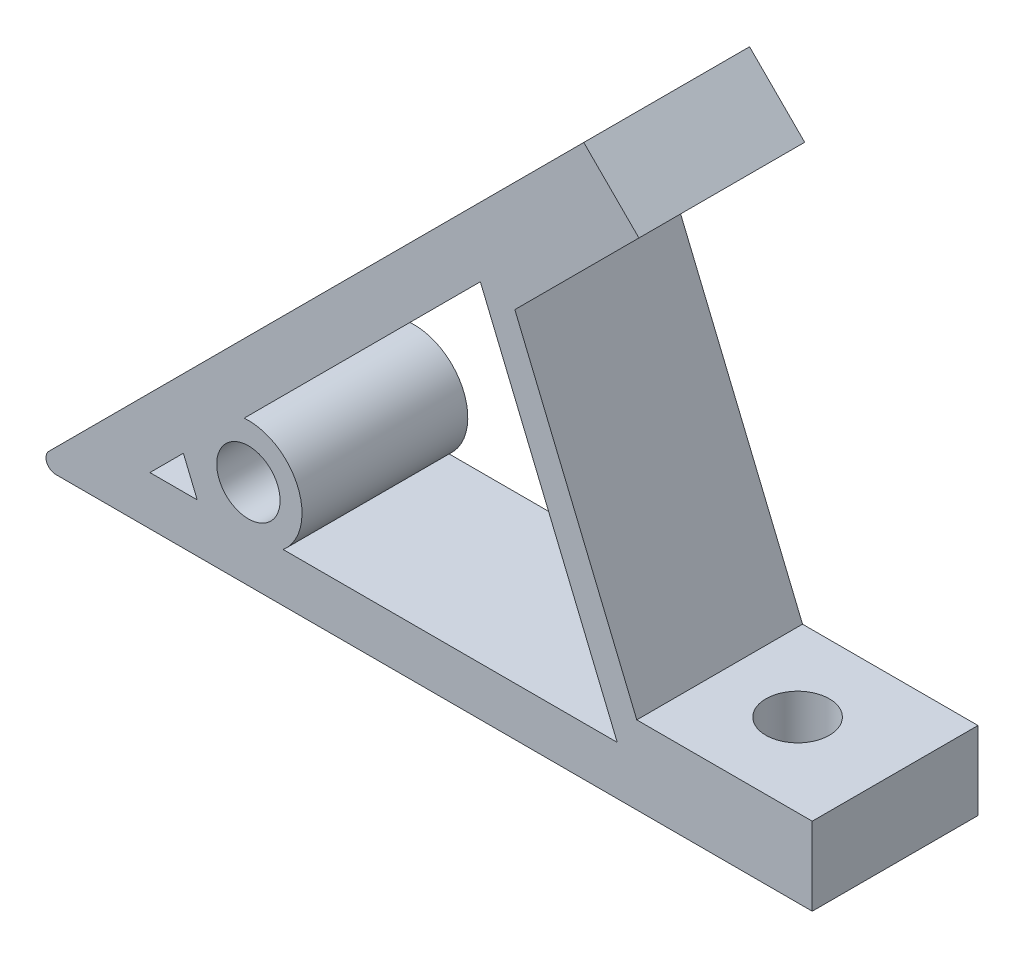
ISO-10303-21;
HEADER;
FILE_DESCRIPTION(('STEP AP214'),'2;1');
FILE_NAME('part.step','',(''),(''),'','','');
FILE_SCHEMA(('AUTOMOTIVE_DESIGN { 1 0 10303 214 1 1 1 1 }'));
ENDSEC;
DATA;
#1=APPLICATION_CONTEXT('core data for automotive mechanical design processes');
#2=APPLICATION_PROTOCOL_DEFINITION('international standard','automotive_design',2000,#1);
#3=PRODUCT_CONTEXT('',#1,'mechanical');
#4=PRODUCT('Part','Part','',(#3));
#5=PRODUCT_RELATED_PRODUCT_CATEGORY('part','',(#4));
#6=PRODUCT_DEFINITION_FORMATION('','',#4);
#7=PRODUCT_DEFINITION_CONTEXT('part definition',#1,'design');
#8=PRODUCT_DEFINITION('design','',#6,#7);
#9=PRODUCT_DEFINITION_SHAPE('','',#8);
#10=(LENGTH_UNIT() NAMED_UNIT(*) SI_UNIT(.MILLI.,.METRE.));
#11=(NAMED_UNIT(*) PLANE_ANGLE_UNIT() SI_UNIT($,.RADIAN.));
#12=(NAMED_UNIT(*) SI_UNIT($,.STERADIAN.) SOLID_ANGLE_UNIT());
#13=UNCERTAINTY_MEASURE_WITH_UNIT(LENGTH_MEASURE(1.E-05),#10,'distance_accuracy_value','');
#14=(GEOMETRIC_REPRESENTATION_CONTEXT(3) GLOBAL_UNCERTAINTY_ASSIGNED_CONTEXT((#13)) GLOBAL_UNIT_ASSIGNED_CONTEXT((#10,
#11,#12)) REPRESENTATION_CONTEXT('',''));
#15=CARTESIAN_POINT('',(0.,0.,0.));
#16=DIRECTION('',(0.,0.,1.));
#17=DIRECTION('',(1.,0.,0.));
#18=AXIS2_PLACEMENT_3D('',#15,#16,#17);
#19=CARTESIAN_POINT('',(-30.4993179415646,38.1869735594505,8.5));
#20=DIRECTION('',(-0.707106781186548,0.707106781186547,0.));
#21=DIRECTION('',(-0.707106781186547,-0.707106781186548,0.));
#22=AXIS2_PLACEMENT_3D('',#19,#20,#21);
#23=PLANE('',#22);
#24=DIRECTION('',(0.707106781186547,0.707106781186548,0.));
#25=VECTOR('',#24,1.);
#26=CARTESIAN_POINT('',(-30.4993179415646,38.1869735594505,-8.5));
#27=LINE('',#26,#25);
#28=CARTESIAN_POINT('',(-30.4993179415646,38.1869735594505,-8.5));
#29=VERTEX_POINT('',#28);
#30=CARTESIAN_POINT('',(-17.7746032555838,50.9116882454314,-8.5));
#31=VERTEX_POINT('',#30);
#32=EDGE_CURVE('E236',#29,#31,#27,.T.);
#33=ORIENTED_EDGE('',*,*,#32,.T.);
#34=DIRECTION('',(0.,0.,-1.));
#35=VECTOR('',#34,1.);
#36=CARTESIAN_POINT('',(-17.7746032555838,50.9116882454314,8.5));
#37=LINE('',#36,#35);
#38=CARTESIAN_POINT('',(-17.7746032555838,50.9116882454314,8.5));
#39=VERTEX_POINT('',#38);
#40=EDGE_CURVE('E246',#39,#31,#37,.T.);
#41=ORIENTED_EDGE('',*,*,#40,.F.);
#42=DIRECTION('',(0.707106781186547,0.707106781186548,0.));
#43=VECTOR('',#42,1.);
#44=CARTESIAN_POINT('',(-30.4993179415646,38.1869735594505,8.5));
#45=LINE('',#44,#43);
#46=CARTESIAN_POINT('',(-30.4993179415646,38.1869735594505,8.5));
#47=VERTEX_POINT('',#46);
#48=EDGE_CURVE('E219',#47,#39,#45,.T.);
#49=ORIENTED_EDGE('',*,*,#48,.F.);
#50=DIRECTION('',(0.,0.,-1.));
#51=VECTOR('',#50,1.);
#52=CARTESIAN_POINT('',(-30.4993179415646,38.1869735594505,8.5));
#53=LINE('',#52,#51);
#54=EDGE_CURVE('E249',#47,#29,#53,.T.);
#55=ORIENTED_EDGE('',*,*,#54,.T.);
#56=EDGE_LOOP('',(#33,#41,#49,#55));
#57=FACE_BOUND('',#56,.T.);
#58=CARTESIAN_POINT('',(-24.8456710674492,43.8406204335659,0.));
#59=DIRECTION('',(-0.70710678118655,0.707106781186545,0.));
#60=DIRECTION('',(-0.707106781186546,-0.707106781186549,0.));
#61=AXIS2_PLACEMENT_3D('',#58,#59,#60);
#62=CIRCLE('',#61,3.25);
#63=CARTESIAN_POINT('',(-27.1437681063054,41.5425233947096,0.));
#64=VERTEX_POINT('',#63);
#65=EDGE_CURVE('E305',#64,#64,#62,.T.);
#66=ORIENTED_EDGE('',*,*,#65,.T.);
#67=EDGE_LOOP('',(#66));
#68=FACE_BOUND('',#67,.T.);
#69=ADVANCED_FACE('F35',(#57,#68),#23,.F.);
#70=CARTESIAN_POINT('',(-78.2928932188134,1.7071067811866,8.5));
#71=DIRECTION('',(0.707106781186548,-0.707106781186547,0.));
#72=DIRECTION('',(0.707106781186547,0.707106781186548,0.));
#73=AXIS2_PLACEMENT_3D('',#70,#71,#72);
#74=PLANE('',#73);
#75=DIRECTION('',(-0.707106781186547,-0.707106781186548,0.));
#76=VECTOR('',#75,1.);
#77=CARTESIAN_POINT('',(-78.2928932188134,1.7071067811866,-8.5));
#78=LINE('',#77,#76);
#79=CARTESIAN_POINT('',(-23.4314575050762,56.5685424949238,-8.5));
#80=VERTEX_POINT('',#79);
#81=CARTESIAN_POINT('',(-78.2928932188134,1.7071067811866,-8.5));
#82=VERTEX_POINT('',#81);
#83=EDGE_CURVE('E211',#80,#82,#78,.T.);
#84=ORIENTED_EDGE('',*,*,#83,.T.);
#85=DIRECTION('',(0.,0.,-1.));
#86=VECTOR('',#85,1.);
#87=CARTESIAN_POINT('',(-78.2928932188134,1.7071067811866,8.5));
#88=LINE('',#87,#86);
#89=CARTESIAN_POINT('',(-78.2928932188134,1.7071067811866,8.5));
#90=VERTEX_POINT('',#89);
#91=EDGE_CURVE('E225',#90,#82,#88,.T.);
#92=ORIENTED_EDGE('',*,*,#91,.F.);
#93=DIRECTION('',(-0.707106781186547,-0.707106781186548,0.));
#94=VECTOR('',#93,1.);
#95=CARTESIAN_POINT('',(-78.2928932188134,1.7071067811866,8.5));
#96=LINE('',#95,#94);
#97=CARTESIAN_POINT('',(-23.4314575050762,56.5685424949238,8.5));
#98=VERTEX_POINT('',#97);
#99=EDGE_CURVE('E223',#98,#90,#96,.T.);
#100=ORIENTED_EDGE('',*,*,#99,.F.);
#101=DIRECTION('',(0.,0.,-1.));
#102=VECTOR('',#101,1.);
#103=CARTESIAN_POINT('',(-23.4314575050762,56.5685424949238,8.5));
#104=LINE('',#103,#102);
#105=EDGE_CURVE('E243',#98,#80,#104,.T.);
#106=ORIENTED_EDGE('',*,*,#105,.T.);
#107=EDGE_LOOP('',(#84,#92,#100,#106));
#108=FACE_BOUND('',#107,.T.);
#109=CARTESIAN_POINT('',(-30.5025253169417,49.4974746830583,0.));
#110=DIRECTION('',(0.707106781186548,-0.707106781186547,0.));
#111=DIRECTION('',(0.707106781186547,0.707106781186548,0.));
#112=AXIS2_PLACEMENT_3D('',#109,#110,#111);
#113=CIRCLE('',#112,3.25);
#114=CARTESIAN_POINT('',(-28.2044282780854,51.7955717219146,0.));
#115=VERTEX_POINT('',#114);
#116=EDGE_CURVE('E39',#115,#115,#113,.F.);
#117=ORIENTED_EDGE('',*,*,#116,.F.);
#118=EDGE_LOOP('',(#117));
#119=FACE_BOUND('',#118,.T.);
#120=ADVANCED_FACE('F292',(#108,#119),#74,.F.);
#121=CARTESIAN_POINT('',(-77.5857864376269,1.,8.5));
#122=DIRECTION('',(0.,0.,1.));
#123=DIRECTION('',(1.,0.,0.));
#124=AXIS2_PLACEMENT_3D('',#121,#122,#123);
#125=PLANE('',#124);
#126=DIRECTION('',(1.,0.,0.));
#127=VECTOR('',#126,1.);
#128=CARTESIAN_POINT('',(-54.2574687525298,5.,8.5));
#129=LINE('',#128,#127);
#130=CARTESIAN_POINT('',(-54.2574687525298,5.,8.5));
#131=VERTEX_POINT('',#130);
#132=CARTESIAN_POINT('',(-20.,5.,8.5));
#133=VERTEX_POINT('',#132);
#134=EDGE_CURVE('E151',#131,#133,#129,.T.);
#135=ORIENTED_EDGE('',*,*,#134,.F.);
#136=CARTESIAN_POINT('',(-57.8268912197291,9.18440237676214,8.5));
#137=DIRECTION('',(0.,0.,-1.));
#138=DIRECTION('',(1.,0.,0.));
#139=AXIS2_PLACEMENT_3D('',#136,#137,#138);
#140=CIRCLE('',#139,5.49999999999996);
#141=CARTESIAN_POINT('',(-58.2617476840749,14.6671845040599,8.5));
#142=VERTEX_POINT('',#141);
#143=EDGE_CURVE('E143',#142,#131,#140,.T.);
#144=ORIENTED_EDGE('',*,*,#143,.F.);
#145=DIRECTION('',(-0.707106781186549,-0.707106781186546,0.));
#146=VECTOR('',#145,1.);
#147=CARTESIAN_POINT('',(-58.2617476840749,14.6671845040599,8.5));
#148=LINE('',#147,#146);
#149=CARTESIAN_POINT('',(-34.0380592228744,38.8908729652603,8.5));
#150=VERTEX_POINT('',#149);
#151=EDGE_CURVE('E167',#150,#142,#148,.T.);
#152=ORIENTED_EDGE('',*,*,#151,.F.);
#153=DIRECTION('',(-0.382683432365087,0.923879532511288,0.));
#154=VECTOR('',#153,1.);
#155=CARTESIAN_POINT('',(-20.,5.,8.5));
#156=LINE('',#155,#154);
#157=EDGE_CURVE('E165',#133,#150,#156,.T.);
#158=ORIENTED_EDGE('',*,*,#157,.F.);
#159=EDGE_LOOP('',(#135,#144,#152,#158));
#160=FACE_BOUND('',#159,.T.);
#161=CARTESIAN_POINT('',(-77.5857864376269,1.,8.5));
#162=DIRECTION('',(0.,0.,1.));
#163=DIRECTION('',(1.,0.,0.));
#164=AXIS2_PLACEMENT_3D('',#161,#162,#163);
#165=CIRCLE('',#164,1.);
#166=CARTESIAN_POINT('',(-77.5857864376269,0.,8.5));
#167=VERTEX_POINT('',#166);
#168=EDGE_CURVE('E207',#90,#167,#165,.T.);
#169=ORIENTED_EDGE('',*,*,#168,.T.);
#170=DIRECTION('',(1.,0.,0.));
#171=VECTOR('',#170,1.);
#172=CARTESIAN_POINT('',(-77.5857864376269,0.,8.5));
#173=LINE('',#172,#171);
#174=CARTESIAN_POINT('',(0.,0.,8.5));
#175=VERTEX_POINT('',#174);
#176=EDGE_CURVE('E210',#167,#175,#173,.T.);
#177=ORIENTED_EDGE('',*,*,#176,.T.);
#178=DIRECTION('',(0.,1.,0.));
#179=VECTOR('',#178,1.);
#180=CARTESIAN_POINT('',(0.,0.,8.5));
#181=LINE('',#180,#179);
#182=CARTESIAN_POINT('',(0.,8.,8.5));
#183=VERTEX_POINT('',#182);
#184=EDGE_CURVE('E213',#175,#183,#181,.T.);
#185=ORIENTED_EDGE('',*,*,#184,.T.);
#186=DIRECTION('',(-1.,0.,0.));
#187=VECTOR('',#186,1.);
#188=CARTESIAN_POINT('',(-17.995464086242,8.00000000000012,8.5));
#189=LINE('',#188,#187);
#190=CARTESIAN_POINT('',(-17.995464086242,8.00000000000012,8.5));
#191=VERTEX_POINT('',#190);
#192=EDGE_CURVE('E215',#183,#191,#189,.T.);
#193=ORIENTED_EDGE('',*,*,#192,.T.);
#194=DIRECTION('',(-0.382683432365096,0.923879532511284,0.));
#195=VECTOR('',#194,1.);
#196=CARTESIAN_POINT('',(-17.995464086242,8.00000000000012,8.5));
#197=LINE('',#196,#195);
#198=EDGE_CURVE('E217',#191,#47,#197,.T.);
#199=ORIENTED_EDGE('',*,*,#198,.T.);
#200=ORIENTED_EDGE('',*,*,#48,.T.);
#201=DIRECTION('',(-0.707106781186548,0.707106781186547,0.));
#202=VECTOR('',#201,1.);
#203=CARTESIAN_POINT('',(-17.7746032555838,50.9116882454314,8.5));
#204=LINE('',#203,#202);
#205=EDGE_CURVE('E221',#39,#98,#204,.T.);
#206=ORIENTED_EDGE('',*,*,#205,.T.);
#207=ORIENTED_EDGE('',*,*,#99,.T.);
#208=EDGE_LOOP('',(#169,#177,#185,#193,#199,#200,#206,#207));
#209=FACE_BOUND('',#208,.T.);
#210=DIRECTION('',(1.,0.,0.));
#211=VECTOR('',#210,1.);
#212=CARTESIAN_POINT('',(-67.9289321881347,5.,8.5));
#213=LINE('',#212,#211);
#214=CARTESIAN_POINT('',(-67.9289321881347,5.,8.5));
#215=VERTEX_POINT('',#214);
#216=CARTESIAN_POINT('',(-63.0744704704145,5.00000000000011,8.5));
#217=VERTEX_POINT('',#216);
#218=EDGE_CURVE('E185',#215,#217,#213,.T.);
#219=ORIENTED_EDGE('',*,*,#218,.F.);
#220=DIRECTION('',(-0.70710678118656,-0.707106781186535,0.));
#221=VECTOR('',#220,1.);
#222=CARTESIAN_POINT('',(-67.9289321881347,5.,8.5));
#223=LINE('',#222,#221);
#224=CARTESIAN_POINT('',(-64.4963093885244,8.43262279961016,8.5));
#225=VERTEX_POINT('',#224);
#226=EDGE_CURVE('E183',#225,#215,#223,.T.);
#227=ORIENTED_EDGE('',*,*,#226,.F.);
#228=DIRECTION('',(-0.382683432365157,0.923879532511259,0.));
#229=VECTOR('',#228,1.);
#230=CARTESIAN_POINT('',(-63.0744704704145,5.00000000000011,8.5));
#231=LINE('',#230,#229);
#232=EDGE_CURVE('E189',#217,#225,#231,.T.);
#233=ORIENTED_EDGE('',*,*,#232,.F.);
#234=EDGE_LOOP('',(#219,#227,#233));
#235=FACE_BOUND('',#234,.T.);
#236=CARTESIAN_POINT('',(-57.8268912197291,9.18440237676214,8.5));
#237=DIRECTION('',(0.,0.,1.));
#238=DIRECTION('',(1.,0.,0.));
#239=AXIS2_PLACEMENT_3D('',#236,#237,#238);
#240=CIRCLE('',#239,3.25);
#241=CARTESIAN_POINT('',(-54.5768912197291,9.18440237676214,8.5));
#242=VERTEX_POINT('',#241);
#243=EDGE_CURVE('E173',#242,#242,#240,.T.);
#244=ORIENTED_EDGE('',*,*,#243,.F.);
#245=EDGE_LOOP('',(#244));
#246=FACE_BOUND('',#245,.T.);
#247=ADVANCED_FACE('F163',(#160,#209,#235,#246),#125,.T.);
#248=CARTESIAN_POINT('',(-77.5857864376269,1.,-8.5));
#249=DIRECTION('',(0.,0.,1.));
#250=DIRECTION('',(1.,0.,0.));
#251=AXIS2_PLACEMENT_3D('',#248,#249,#250);
#252=PLANE('',#251);
#253=CARTESIAN_POINT('',(-57.8268912197291,9.18440237676214,-8.5));
#254=DIRECTION('',(0.,0.,-1.));
#255=DIRECTION('',(1.,0.,0.));
#256=AXIS2_PLACEMENT_3D('',#253,#254,#255);
#257=CIRCLE('',#256,5.49999999999996);
#258=CARTESIAN_POINT('',(-58.2617476840749,14.6671845040599,-8.5));
#259=VERTEX_POINT('',#258);
#260=CARTESIAN_POINT('',(-54.2574687525298,5.,-8.5));
#261=VERTEX_POINT('',#260);
#262=EDGE_CURVE('E59',#259,#261,#257,.T.);
#263=ORIENTED_EDGE('',*,*,#262,.T.);
#264=DIRECTION('',(1.,0.,0.));
#265=VECTOR('',#264,1.);
#266=CARTESIAN_POINT('',(-54.2574687525298,5.,-8.5));
#267=LINE('',#266,#265);
#268=CARTESIAN_POINT('',(-20.,5.,-8.5));
#269=VERTEX_POINT('',#268);
#270=EDGE_CURVE('E158',#261,#269,#267,.T.);
#271=ORIENTED_EDGE('',*,*,#270,.T.);
#272=DIRECTION('',(-0.382683432365087,0.923879532511288,0.));
#273=VECTOR('',#272,1.);
#274=CARTESIAN_POINT('',(-20.,5.,-8.5));
#275=LINE('',#274,#273);
#276=CARTESIAN_POINT('',(-34.0380592228744,38.8908729652603,-8.5));
#277=VERTEX_POINT('',#276);
#278=EDGE_CURVE('E175',#269,#277,#275,.T.);
#279=ORIENTED_EDGE('',*,*,#278,.T.);
#280=DIRECTION('',(-0.707106781186549,-0.707106781186546,0.));
#281=VECTOR('',#280,1.);
#282=CARTESIAN_POINT('',(-58.2617476840749,14.6671845040599,-8.5));
#283=LINE('',#282,#281);
#284=EDGE_CURVE('E152',#277,#259,#283,.T.);
#285=ORIENTED_EDGE('',*,*,#284,.T.);
#286=EDGE_LOOP('',(#263,#271,#279,#285));
#287=FACE_BOUND('',#286,.T.);
#288=CARTESIAN_POINT('',(-77.5857864376269,1.,-8.5));
#289=DIRECTION('',(0.,0.,1.));
#290=DIRECTION('',(1.,0.,0.));
#291=AXIS2_PLACEMENT_3D('',#288,#289,#290);
#292=CIRCLE('',#291,1.);
#293=CARTESIAN_POINT('',(-77.5857864376269,0.,-8.5));
#294=VERTEX_POINT('',#293);
#295=EDGE_CURVE('E206',#82,#294,#292,.T.);
#296=ORIENTED_EDGE('',*,*,#295,.F.);
#297=ORIENTED_EDGE('',*,*,#83,.F.);
#298=DIRECTION('',(-0.707106781186548,0.707106781186547,0.));
#299=VECTOR('',#298,1.);
#300=CARTESIAN_POINT('',(-17.7746032555838,50.9116882454314,-8.5));
#301=LINE('',#300,#299);
#302=EDGE_CURVE('E238',#31,#80,#301,.T.);
#303=ORIENTED_EDGE('',*,*,#302,.F.);
#304=ORIENTED_EDGE('',*,*,#32,.F.);
#305=DIRECTION('',(-0.382683432365096,0.923879532511284,0.));
#306=VECTOR('',#305,1.);
#307=CARTESIAN_POINT('',(-17.995464086242,8.00000000000012,-8.5));
#308=LINE('',#307,#306);
#309=CARTESIAN_POINT('',(-17.995464086242,8.00000000000012,-8.5));
#310=VERTEX_POINT('',#309);
#311=EDGE_CURVE('E234',#310,#29,#308,.T.);
#312=ORIENTED_EDGE('',*,*,#311,.F.);
#313=DIRECTION('',(-1.,0.,0.));
#314=VECTOR('',#313,1.);
#315=CARTESIAN_POINT('',(-17.995464086242,8.00000000000012,-8.5));
#316=LINE('',#315,#314);
#317=CARTESIAN_POINT('',(0.,8.,-8.5));
#318=VERTEX_POINT('',#317);
#319=EDGE_CURVE('E232',#318,#310,#316,.T.);
#320=ORIENTED_EDGE('',*,*,#319,.F.);
#321=DIRECTION('',(0.,1.,0.));
#322=VECTOR('',#321,1.);
#323=CARTESIAN_POINT('',(0.,0.,-8.5));
#324=LINE('',#323,#322);
#325=CARTESIAN_POINT('',(0.,0.,-8.5));
#326=VERTEX_POINT('',#325);
#327=EDGE_CURVE('E230',#326,#318,#324,.T.);
#328=ORIENTED_EDGE('',*,*,#327,.F.);
#329=DIRECTION('',(1.,0.,0.));
#330=VECTOR('',#329,1.);
#331=CARTESIAN_POINT('',(-77.5857864376269,0.,-8.5));
#332=LINE('',#331,#330);
#333=EDGE_CURVE('E228',#294,#326,#332,.T.);
#334=ORIENTED_EDGE('',*,*,#333,.F.);
#335=EDGE_LOOP('',(#296,#297,#303,#304,#312,#320,#328,#334));
#336=FACE_BOUND('',#335,.T.);
#337=DIRECTION('',(-0.70710678118656,-0.707106781186535,0.));
#338=VECTOR('',#337,1.);
#339=CARTESIAN_POINT('',(-67.9289321881347,5.,-8.5));
#340=LINE('',#339,#338);
#341=CARTESIAN_POINT('',(-64.4963093885244,8.43262279961016,-8.5));
#342=VERTEX_POINT('',#341);
#343=CARTESIAN_POINT('',(-67.9289321881347,5.,-8.5));
#344=VERTEX_POINT('',#343);
#345=EDGE_CURVE('E159',#342,#344,#340,.T.);
#346=ORIENTED_EDGE('',*,*,#345,.T.);
#347=DIRECTION('',(1.,0.,0.));
#348=VECTOR('',#347,1.);
#349=CARTESIAN_POINT('',(-67.9289321881347,5.,-8.5));
#350=LINE('',#349,#348);
#351=CARTESIAN_POINT('',(-63.0744704704145,5.00000000000011,-8.5));
#352=VERTEX_POINT('',#351);
#353=EDGE_CURVE('E194',#344,#352,#350,.T.);
#354=ORIENTED_EDGE('',*,*,#353,.T.);
#355=DIRECTION('',(-0.382683432365157,0.923879532511259,0.));
#356=VECTOR('',#355,1.);
#357=CARTESIAN_POINT('',(-63.0744704704145,5.00000000000011,-8.5));
#358=LINE('',#357,#356);
#359=EDGE_CURVE('E186',#352,#342,#358,.T.);
#360=ORIENTED_EDGE('',*,*,#359,.T.);
#361=EDGE_LOOP('',(#346,#354,#360));
#362=FACE_BOUND('',#361,.T.);
#363=CARTESIAN_POINT('',(-57.8268912197291,9.18440237676214,-8.5));
#364=DIRECTION('',(0.,0.,1.));
#365=DIRECTION('',(1.,0.,0.));
#366=AXIS2_PLACEMENT_3D('',#363,#364,#365);
#367=CIRCLE('',#366,3.25);
#368=CARTESIAN_POINT('',(-54.5768912197291,9.18440237676214,-8.5));
#369=VERTEX_POINT('',#368);
#370=EDGE_CURVE('E316',#369,#369,#367,.T.);
#371=ORIENTED_EDGE('',*,*,#370,.T.);
#372=EDGE_LOOP('',(#371));
#373=FACE_BOUND('',#372,.T.);
#374=ADVANCED_FACE('F269',(#287,#336,#362,#373),#252,.F.);
#375=CARTESIAN_POINT('',(-77.5857864376269,1.,8.5));
#376=DIRECTION('',(0.,0.,-1.));
#377=DIRECTION('',(-1.,0.,0.));
#378=AXIS2_PLACEMENT_3D('',#375,#376,#377);
#379=CYLINDRICAL_SURFACE('',#378,1.);
#380=ORIENTED_EDGE('',*,*,#295,.T.);
#381=DIRECTION('',(0.,0.,-1.));
#382=VECTOR('',#381,1.);
#383=CARTESIAN_POINT('',(-77.5857864376269,0.,8.5));
#384=LINE('',#383,#382);
#385=EDGE_CURVE('E11',#167,#294,#384,.T.);
#386=ORIENTED_EDGE('',*,*,#385,.F.);
#387=ORIENTED_EDGE('',*,*,#168,.F.);
#388=ORIENTED_EDGE('',*,*,#91,.T.);
#389=EDGE_LOOP('',(#380,#386,#387,#388));
#390=FACE_BOUND('',#389,.T.);
#391=ADVANCED_FACE('F37',(#390),#379,.T.);
#392=CARTESIAN_POINT('',(-77.5857864376269,0.,8.5));
#393=DIRECTION('',(0.,1.,0.));
#394=DIRECTION('',(0.,0.,1.));
#395=AXIS2_PLACEMENT_3D('',#392,#393,#394);
#396=PLANE('',#395);
#397=CARTESIAN_POINT('',(-10.,0.,0.));
#398=DIRECTION('',(0.,1.,0.));
#399=DIRECTION('',(0.,0.,1.));
#400=AXIS2_PLACEMENT_3D('',#397,#398,#399);
#401=CIRCLE('',#400,3.25);
#402=CARTESIAN_POINT('',(-10.,0.,3.25));
#403=VERTEX_POINT('',#402);
#404=EDGE_CURVE('E313',#403,#403,#401,.T.);
#405=ORIENTED_EDGE('',*,*,#404,.T.);
#406=EDGE_LOOP('',(#405));
#407=FACE_BOUND('',#406,.T.);
#408=ORIENTED_EDGE('',*,*,#333,.T.);
#409=DIRECTION('',(0.,0.,-1.));
#410=VECTOR('',#409,1.);
#411=CARTESIAN_POINT('',(0.,0.,8.5));
#412=LINE('',#411,#410);
#413=EDGE_CURVE('E44',#175,#326,#412,.T.);
#414=ORIENTED_EDGE('',*,*,#413,.F.);
#415=ORIENTED_EDGE('',*,*,#176,.F.);
#416=ORIENTED_EDGE('',*,*,#385,.T.);
#417=EDGE_LOOP('',(#408,#414,#415,#416));
#418=FACE_BOUND('',#417,.T.);
#419=ADVANCED_FACE('F286',(#407,#418),#396,.F.);
#420=CARTESIAN_POINT('',(0.,0.,8.5));
#421=DIRECTION('',(-1.,0.,0.));
#422=DIRECTION('',(0.,0.,1.));
#423=AXIS2_PLACEMENT_3D('',#420,#421,#422);
#424=PLANE('',#423);
#425=ORIENTED_EDGE('',*,*,#327,.T.);
#426=DIRECTION('',(0.,0.,-1.));
#427=VECTOR('',#426,1.);
#428=CARTESIAN_POINT('',(0.,8.,8.5));
#429=LINE('',#428,#427);
#430=EDGE_CURVE('E255',#183,#318,#429,.T.);
#431=ORIENTED_EDGE('',*,*,#430,.F.);
#432=ORIENTED_EDGE('',*,*,#184,.F.);
#433=ORIENTED_EDGE('',*,*,#413,.T.);
#434=EDGE_LOOP('',(#425,#431,#432,#433));
#435=FACE_BOUND('',#434,.T.);
#436=ADVANCED_FACE('F263',(#435),#424,.F.);
#437=CARTESIAN_POINT('',(-17.995464086242,8.00000000000012,8.5));
#438=DIRECTION('',(0.,-1.,0.));
#439=DIRECTION('',(1.,0.,0.));
#440=AXIS2_PLACEMENT_3D('',#437,#438,#439);
#441=PLANE('',#440);
#442=CARTESIAN_POINT('',(-10.,8.00000000000006,0.));
#443=DIRECTION('',(0.,1.,0.));
#444=DIRECTION('',(-1.,0.,0.));
#445=AXIS2_PLACEMENT_3D('',#442,#443,#444);
#446=CIRCLE('',#445,3.25);
#447=CARTESIAN_POINT('',(-13.25,8.00000000000009,0.));
#448=VERTEX_POINT('',#447);
#449=EDGE_CURVE('E309',#448,#448,#446,.T.);
#450=ORIENTED_EDGE('',*,*,#449,.F.);
#451=EDGE_LOOP('',(#450));
#452=FACE_BOUND('',#451,.T.);
#453=ORIENTED_EDGE('',*,*,#319,.T.);
#454=DIRECTION('',(0.,0.,-1.));
#455=VECTOR('',#454,1.);
#456=CARTESIAN_POINT('',(-17.995464086242,8.00000000000012,8.5));
#457=LINE('',#456,#455);
#458=EDGE_CURVE('E252',#191,#310,#457,.T.);
#459=ORIENTED_EDGE('',*,*,#458,.F.);
#460=ORIENTED_EDGE('',*,*,#192,.F.);
#461=ORIENTED_EDGE('',*,*,#430,.T.);
#462=EDGE_LOOP('',(#453,#459,#460,#461));
#463=FACE_BOUND('',#462,.T.);
#464=ADVANCED_FACE('F275',(#452,#463),#441,.F.);
#465=CARTESIAN_POINT('',(-17.995464086242,8.00000000000012,8.5));
#466=DIRECTION('',(-0.923879532511284,-0.382683432365096,0.));
#467=DIRECTION('',(0.382683432365096,-0.923879532511284,0.));
#468=AXIS2_PLACEMENT_3D('',#465,#466,#467);
#469=PLANE('',#468);
#470=ORIENTED_EDGE('',*,*,#311,.T.);
#471=ORIENTED_EDGE('',*,*,#54,.F.);
#472=ORIENTED_EDGE('',*,*,#198,.F.);
#473=ORIENTED_EDGE('',*,*,#458,.T.);
#474=EDGE_LOOP('',(#470,#471,#472,#473));
#475=FACE_BOUND('',#474,.T.);
#476=ADVANCED_FACE('F279',(#475),#469,.F.);
#477=CARTESIAN_POINT('',(-17.7746032555838,50.9116882454314,8.5));
#478=DIRECTION('',(-0.707106781186547,-0.707106781186548,0.));
#479=DIRECTION('',(0.707106781186548,-0.707106781186547,0.));
#480=AXIS2_PLACEMENT_3D('',#477,#478,#479);
#481=PLANE('',#480);
#482=ORIENTED_EDGE('',*,*,#302,.T.);
#483=ORIENTED_EDGE('',*,*,#105,.F.);
#484=ORIENTED_EDGE('',*,*,#205,.F.);
#485=ORIENTED_EDGE('',*,*,#40,.T.);
#486=EDGE_LOOP('',(#482,#483,#484,#485));
#487=FACE_BOUND('',#486,.T.);
#488=ADVANCED_FACE('F298',(#487),#481,.F.);
#489=CARTESIAN_POINT('',(-67.9289321881347,5.,8.5));
#490=DIRECTION('',(0.707106781186535,-0.70710678118656,0.));
#491=DIRECTION('',(0.70710678118656,0.707106781186535,0.));
#492=AXIS2_PLACEMENT_3D('',#489,#490,#491);
#493=PLANE('',#492);
#494=ORIENTED_EDGE('',*,*,#345,.F.);
#495=DIRECTION('',(0.,0.,-1.));
#496=VECTOR('',#495,1.);
#497=CARTESIAN_POINT('',(-64.4963093885244,8.43262279961016,8.5));
#498=LINE('',#497,#496);
#499=EDGE_CURVE('E191',#225,#342,#498,.T.);
#500=ORIENTED_EDGE('',*,*,#499,.F.);
#501=ORIENTED_EDGE('',*,*,#226,.T.);
#502=DIRECTION('',(0.,0.,-1.));
#503=VECTOR('',#502,1.);
#504=CARTESIAN_POINT('',(-67.9289321881347,5.,8.5));
#505=LINE('',#504,#503);
#506=EDGE_CURVE('E203',#215,#344,#505,.T.);
#507=ORIENTED_EDGE('',*,*,#506,.T.);
#508=EDGE_LOOP('',(#494,#500,#501,#507));
#509=FACE_BOUND('',#508,.T.);
#510=ADVANCED_FACE('F353',(#509),#493,.T.);
#511=CARTESIAN_POINT('',(-67.9289321881347,5.,8.5));
#512=DIRECTION('',(0.,1.,0.));
#513=DIRECTION('',(-1.,0.,0.));
#514=AXIS2_PLACEMENT_3D('',#511,#512,#513);
#515=PLANE('',#514);
#516=ORIENTED_EDGE('',*,*,#353,.F.);
#517=ORIENTED_EDGE('',*,*,#506,.F.);
#518=ORIENTED_EDGE('',*,*,#218,.T.);
#519=DIRECTION('',(0.,0.,-1.));
#520=VECTOR('',#519,1.);
#521=CARTESIAN_POINT('',(-63.0744704704145,5.00000000000011,8.5));
#522=LINE('',#521,#520);
#523=EDGE_CURVE('E201',#217,#352,#522,.T.);
#524=ORIENTED_EDGE('',*,*,#523,.T.);
#525=EDGE_LOOP('',(#516,#517,#518,#524));
#526=FACE_BOUND('',#525,.T.);
#527=ADVANCED_FACE('F349',(#526),#515,.T.);
#528=CARTESIAN_POINT('',(-63.0744704704145,5.00000000000011,8.5));
#529=DIRECTION('',(-0.923879532511259,-0.382683432365157,0.));
#530=DIRECTION('',(0.382683432365157,-0.923879532511259,0.));
#531=AXIS2_PLACEMENT_3D('',#528,#529,#530);
#532=PLANE('',#531);
#533=ORIENTED_EDGE('',*,*,#359,.F.);
#534=ORIENTED_EDGE('',*,*,#523,.F.);
#535=ORIENTED_EDGE('',*,*,#232,.T.);
#536=ORIENTED_EDGE('',*,*,#499,.T.);
#537=EDGE_LOOP('',(#533,#534,#535,#536));
#538=FACE_BOUND('',#537,.T.);
#539=ADVANCED_FACE('F346',(#538),#532,.T.);
#540=CARTESIAN_POINT('',(-57.8268912197291,9.18440237676214,8.5));
#541=DIRECTION('',(0.,0.,-1.));
#542=DIRECTION('',(-1.,0.,0.));
#543=AXIS2_PLACEMENT_3D('',#540,#541,#542);
#544=CYLINDRICAL_SURFACE('',#543,5.49999999999996);
#545=ORIENTED_EDGE('',*,*,#262,.F.);
#546=DIRECTION('',(0.,0.,-1.));
#547=VECTOR('',#546,1.);
#548=CARTESIAN_POINT('',(-58.2617476840749,14.6671845040599,8.5));
#549=LINE('',#548,#547);
#550=EDGE_CURVE('E147',#142,#259,#549,.T.);
#551=ORIENTED_EDGE('',*,*,#550,.F.);
#552=ORIENTED_EDGE('',*,*,#143,.T.);
#553=DIRECTION('',(0.,0.,-1.));
#554=VECTOR('',#553,1.);
#555=CARTESIAN_POINT('',(-54.2574687525298,5.,8.5));
#556=LINE('',#555,#554);
#557=EDGE_CURVE('E146',#131,#261,#556,.T.);
#558=ORIENTED_EDGE('',*,*,#557,.T.);
#559=EDGE_LOOP('',(#545,#551,#552,#558));
#560=FACE_BOUND('',#559,.T.);
#561=ADVANCED_FACE('F145',(#560),#544,.T.);
#562=CARTESIAN_POINT('',(-54.2574687525298,5.,8.5));
#563=DIRECTION('',(0.,1.,0.));
#564=DIRECTION('',(0.,0.,1.));
#565=AXIS2_PLACEMENT_3D('',#562,#563,#564);
#566=PLANE('',#565);
#567=ORIENTED_EDGE('',*,*,#270,.F.);
#568=ORIENTED_EDGE('',*,*,#557,.F.);
#569=ORIENTED_EDGE('',*,*,#134,.T.);
#570=DIRECTION('',(0.,0.,-1.));
#571=VECTOR('',#570,1.);
#572=CARTESIAN_POINT('',(-20.,5.,8.5));
#573=LINE('',#572,#571);
#574=EDGE_CURVE('E160',#133,#269,#573,.T.);
#575=ORIENTED_EDGE('',*,*,#574,.T.);
#576=EDGE_LOOP('',(#567,#568,#569,#575));
#577=FACE_BOUND('',#576,.T.);
#578=ADVANCED_FACE('F155',(#577),#566,.T.);
#579=CARTESIAN_POINT('',(-20.,5.,8.5));
#580=DIRECTION('',(-0.923879532511288,-0.382683432365087,0.));
#581=DIRECTION('',(0.382683432365087,-0.923879532511288,0.));
#582=AXIS2_PLACEMENT_3D('',#579,#580,#581);
#583=PLANE('',#582);
#584=ORIENTED_EDGE('',*,*,#278,.F.);
#585=ORIENTED_EDGE('',*,*,#574,.F.);
#586=ORIENTED_EDGE('',*,*,#157,.T.);
#587=DIRECTION('',(0.,0.,-1.));
#588=VECTOR('',#587,1.);
#589=CARTESIAN_POINT('',(-34.0380592228744,38.8908729652603,8.5));
#590=LINE('',#589,#588);
#591=EDGE_CURVE('E51',#150,#277,#590,.T.);
#592=ORIENTED_EDGE('',*,*,#591,.T.);
#593=EDGE_LOOP('',(#584,#585,#586,#592));
#594=FACE_BOUND('',#593,.T.);
#595=ADVANCED_FACE('F335',(#594),#583,.T.);
#596=CARTESIAN_POINT('',(-58.2617476840749,14.6671845040599,8.5));
#597=DIRECTION('',(0.707106781186546,-0.707106781186549,0.));
#598=DIRECTION('',(0.707106781186549,0.707106781186546,0.));
#599=AXIS2_PLACEMENT_3D('',#596,#597,#598);
#600=PLANE('',#599);
#601=ORIENTED_EDGE('',*,*,#284,.F.);
#602=ORIENTED_EDGE('',*,*,#591,.F.);
#603=ORIENTED_EDGE('',*,*,#151,.T.);
#604=ORIENTED_EDGE('',*,*,#550,.T.);
#605=EDGE_LOOP('',(#601,#602,#603,#604));
#606=FACE_BOUND('',#605,.T.);
#607=ADVANCED_FACE('F325',(#606),#600,.T.);
#608=CARTESIAN_POINT('',(-57.8268912197291,9.18440237676214,8.5));
#609=DIRECTION('',(0.,0.,-1.));
#610=DIRECTION('',(-1.,0.,0.));
#611=AXIS2_PLACEMENT_3D('',#608,#609,#610);
#612=CYLINDRICAL_SURFACE('',#611,3.25);
#613=ORIENTED_EDGE('',*,*,#243,.T.);
#614=EDGE_LOOP('',(#613));
#615=FACE_BOUND('',#614,.T.);
#616=ORIENTED_EDGE('',*,*,#370,.F.);
#617=EDGE_LOOP('',(#616));
#618=FACE_BOUND('',#617,.T.);
#619=ADVANCED_FACE('F322',(#615,#618),#612,.F.);
#620=CARTESIAN_POINT('',(-10.0000000000001,-8.99999999999994,0.));
#621=DIRECTION('',(0.,1.,0.));
#622=DIRECTION('',(-1.,0.,0.));
#623=AXIS2_PLACEMENT_3D('',#620,#621,#622);
#624=CYLINDRICAL_SURFACE('',#623,3.25);
#625=ORIENTED_EDGE('',*,*,#449,.T.);
#626=EDGE_LOOP('',(#625));
#627=FACE_BOUND('',#626,.T.);
#628=ORIENTED_EDGE('',*,*,#404,.F.);
#629=EDGE_LOOP('',(#628));
#630=FACE_BOUND('',#629,.T.);
#631=ADVANCED_FACE('F324',(#627,#630),#624,.F.);
#632=CARTESIAN_POINT('',(-36.8664863476205,55.8614357137372,0.));
#633=DIRECTION('',(0.70710678118655,-0.707106781186545,0.));
#634=DIRECTION('',(0.707106781186545,0.70710678118655,0.));
#635=AXIS2_PLACEMENT_3D('',#632,#633,#634);
#636=CYLINDRICAL_SURFACE('',#635,3.25);
#637=ORIENTED_EDGE('',*,*,#65,.F.);
#638=EDGE_LOOP('',(#637));
#639=FACE_BOUND('',#638,.T.);
#640=ORIENTED_EDGE('',*,*,#116,.T.);
#641=EDGE_LOOP('',(#640));
#642=FACE_BOUND('',#641,.T.);
#643=ADVANCED_FACE('F332',(#639,#642),#636,.F.);
#644=CLOSED_SHELL('',(#69,#120,#247,#374,#391,#419,#436,#464,#476,#488,#510,#527,#539,#561,#578,
#595,#607,#619,#631,#643));
#645=MANIFOLD_SOLID_BREP('B2',#644);
#646=ADVANCED_BREP_SHAPE_REPRESENTATION('',(#18,#645),#14);
#647=SHAPE_DEFINITION_REPRESENTATION(#9,#646);
ENDSEC;
END-ISO-10303-21;
